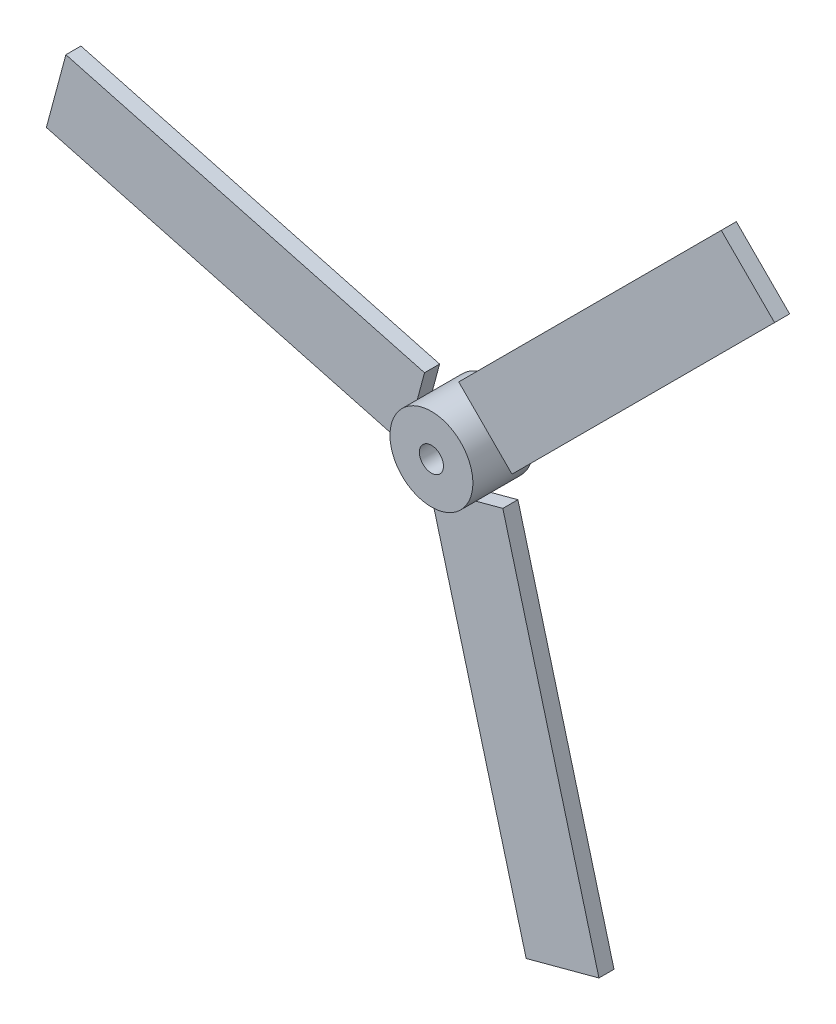
ISO-10303-21;
HEADER;
FILE_DESCRIPTION(('STEP AP214'),'2;1');
FILE_NAME('part.step','',(''),(''),'','','');
FILE_SCHEMA(('AUTOMOTIVE_DESIGN { 1 0 10303 214 1 1 1 1 }'));
ENDSEC;
DATA;
#1=APPLICATION_CONTEXT('core data for automotive mechanical design processes');
#2=APPLICATION_PROTOCOL_DEFINITION('international standard','automotive_design',2000,#1);
#3=PRODUCT_CONTEXT('',#1,'mechanical');
#4=PRODUCT('Part','Part','',(#3));
#5=PRODUCT_RELATED_PRODUCT_CATEGORY('part','',(#4));
#6=PRODUCT_DEFINITION_FORMATION('','',#4);
#7=PRODUCT_DEFINITION_CONTEXT('part definition',#1,'design');
#8=PRODUCT_DEFINITION('design','',#6,#7);
#9=PRODUCT_DEFINITION_SHAPE('','',#8);
#10=(LENGTH_UNIT() NAMED_UNIT(*) SI_UNIT(.MILLI.,.METRE.));
#11=(NAMED_UNIT(*) PLANE_ANGLE_UNIT() SI_UNIT($,.RADIAN.));
#12=(NAMED_UNIT(*) SI_UNIT($,.STERADIAN.) SOLID_ANGLE_UNIT());
#13=UNCERTAINTY_MEASURE_WITH_UNIT(LENGTH_MEASURE(1.E-05),#10,'distance_accuracy_value','');
#14=(GEOMETRIC_REPRESENTATION_CONTEXT(3) GLOBAL_UNCERTAINTY_ASSIGNED_CONTEXT((#13)) GLOBAL_UNIT_ASSIGNED_CONTEXT((#10,
#11,#12)) REPRESENTATION_CONTEXT('',''));
#15=CARTESIAN_POINT('',(0.,0.,0.));
#16=DIRECTION('',(0.,0.,1.));
#17=DIRECTION('',(1.,0.,0.));
#18=AXIS2_PLACEMENT_3D('',#15,#16,#17);
#19=CARTESIAN_POINT('',(42.638538905549,-42.63853890554,14.3));
#20=DIRECTION('',(0.,0.,1.));
#21=DIRECTION('',(1.,0.,0.));
#22=AXIS2_PLACEMENT_3D('',#19,#20,#21);
#23=PLANE('',#22);
#24=CARTESIAN_POINT('',(42.638538905549,-42.63853890554,14.3));
#25=DIRECTION('',(0.,0.,1.));
#26=DIRECTION('',(0.707106781186548,0.707106781186548,0.));
#27=AXIS2_PLACEMENT_3D('',#24,#25,#26);
#28=CIRCLE('',#27,0.8);
#29=CARTESIAN_POINT('',(43.204224330498,-42.0728534806,14.3));
#30=VERTEX_POINT('',#29);
#31=EDGE_CURVE('P0_E21',#30,#30,#28,.T.);
#32=ORIENTED_EDGE('',*,*,#31,.F.);
#33=EDGE_LOOP('',(#32));
#34=FACE_BOUND('',#33,.T.);
#35=CARTESIAN_POINT('',(42.638538905549,-42.63853890554,14.3));
#36=DIRECTION('',(0.,0.,1.));
#37=DIRECTION('',(0.707106781186548,0.707106781186548,0.));
#38=AXIS2_PLACEMENT_3D('',#35,#36,#37);
#39=CIRCLE('',#38,2.75);
#40=CARTESIAN_POINT('',(44.583082553812,-40.69399525728,14.3));
#41=VERTEX_POINT('',#40);
#42=EDGE_CURVE('P0_E58',#41,#41,#39,.T.);
#43=ORIENTED_EDGE('',*,*,#42,.T.);
#44=EDGE_LOOP('',(#43));
#45=FACE_BOUND('',#44,.T.);
#46=ADVANCED_FACE('P0_F17',(#34,#45),#23,.T.);
#47=CARTESIAN_POINT('',(42.638538905549,-42.63853890554,10.3));
#48=DIRECTION('',(0.,0.,1.));
#49=DIRECTION('',(1.,0.,0.));
#50=AXIS2_PLACEMENT_3D('',#47,#48,#49);
#51=PLANE('',#50);
#52=CARTESIAN_POINT('',(42.638538905549,-42.63853890554,10.3));
#53=DIRECTION('',(0.,0.,1.));
#54=DIRECTION('',(0.707106781186548,0.707106781186548,0.));
#55=AXIS2_PLACEMENT_3D('',#52,#53,#54);
#56=CIRCLE('',#55,0.8);
#57=CARTESIAN_POINT('',(43.204224330498,-42.0728534806,10.3));
#58=VERTEX_POINT('',#57);
#59=EDGE_CURVE('P0_E11',#58,#58,#56,.T.);
#60=ORIENTED_EDGE('',*,*,#59,.T.);
#61=EDGE_LOOP('',(#60));
#62=FACE_BOUND('',#61,.T.);
#63=CARTESIAN_POINT('',(42.638538905549,-42.63853890554,10.3));
#64=DIRECTION('',(0.,0.,1.));
#65=DIRECTION('',(0.707106781186548,0.707106781186548,0.));
#66=AXIS2_PLACEMENT_3D('',#63,#64,#65);
#67=CIRCLE('',#66,2.75);
#68=CARTESIAN_POINT('',(44.583082553812,-40.69399525728,10.3));
#69=VERTEX_POINT('',#68);
#70=EDGE_CURVE('P0_E56',#69,#69,#67,.T.);
#71=ORIENTED_EDGE('',*,*,#70,.F.);
#72=EDGE_LOOP('',(#71));
#73=FACE_BOUND('',#72,.T.);
#74=ADVANCED_FACE('P0_F19',(#62,#73),#51,.F.);
#75=CARTESIAN_POINT('',(42.638538905549,-42.63853890554,10.3));
#76=DIRECTION('',(0.,0.,-1.));
#77=DIRECTION('',(0.707106781186548,0.707106781186548,0.));
#78=AXIS2_PLACEMENT_3D('',#75,#76,#77);
#79=CYLINDRICAL_SURFACE('',#78,0.8);
#80=DIRECTION('',(0.,0.,1.));
#81=VECTOR('',#80,1.);
#82=CARTESIAN_POINT('',(43.204224330498,-42.0728534806,10.3));
#83=LINE('',#82,#81);
#84=EDGE_CURVE('P0_E70',#58,#30,#83,.T.);
#85=ORIENTED_EDGE('',*,*,#84,.T.);
#86=ORIENTED_EDGE('',*,*,#31,.T.);
#87=ORIENTED_EDGE('',*,*,#84,.F.);
#88=ORIENTED_EDGE('',*,*,#59,.F.);
#89=EDGE_LOOP('',(#85,#86,#87,#88));
#90=FACE_BOUND('',#89,.T.);
#91=ADVANCED_FACE('P0_F82',(#90),#79,.F.);
#92=CARTESIAN_POINT('',(42.638538905549,-42.63853890554,10.3));
#93=DIRECTION('',(0.,0.,-1.));
#94=DIRECTION('',(0.707106781186548,0.707106781186548,0.));
#95=AXIS2_PLACEMENT_3D('',#92,#93,#94);
#96=CYLINDRICAL_SURFACE('',#95,2.75);
#97=ORIENTED_EDGE('',*,*,#70,.T.);
#98=DIRECTION('',(0.,0.,1.));
#99=VECTOR('',#98,1.);
#100=CARTESIAN_POINT('',(44.583082553812,-40.69399525728,10.3));
#101=LINE('',#100,#99);
#102=EDGE_CURVE('P0_E57',#69,#41,#101,.T.);
#103=ORIENTED_EDGE('',*,*,#102,.T.);
#104=ORIENTED_EDGE('',*,*,#42,.F.);
#105=ORIENTED_EDGE('',*,*,#102,.F.);
#106=EDGE_LOOP('',(#97,#103,#104,#105));
#107=FACE_BOUND('',#106,.T.);
#108=ADVANCED_FACE('P0_F60',(#107),#96,.T.);
#109=CLOSED_SHELL('',(#46,#74,#91,#108));
#110=MANIFOLD_SOLID_BREP('P0_B1',#109);
#111=CARTESIAN_POINT('',(53.329993437089,-31.947084374,12.7));
#112=DIRECTION('',(0.,0.,1.));
#113=DIRECTION('',(1.,0.,0.));
#114=AXIS2_PLACEMENT_3D('',#111,#112,#113);
#115=PLANE('',#114);
#116=DIRECTION('',(0.707106781186548,0.707106781186548,0.));
#117=VECTOR('',#116,1.);
#118=CARTESIAN_POINT('',(46.386204845838,-42.42640687119,12.7));
#119=LINE('',#118,#117);
#120=CARTESIAN_POINT('',(46.386204845838,-42.42640687119,12.7));
#121=VERTEX_POINT('',#120);
#122=CARTESIAN_POINT('',(63.809315934274,-25.00329578275,12.7));
#123=VERTEX_POINT('',#122);
#124=EDGE_CURVE('P1_E83',#121,#123,#119,.T.);
#125=ORIENTED_EDGE('',*,*,#124,.T.);
#126=DIRECTION('',(-0.707106781186548,0.707106781186548,0.));
#127=VECTOR('',#126,1.);
#128=CARTESIAN_POINT('',(63.809315934274,-25.00329578275,12.7));
#129=LINE('',#128,#127);
#130=CARTESIAN_POINT('',(60.273782028341,-21.46776187682,12.7));
#131=VERTEX_POINT('',#130);
#132=EDGE_CURVE('P1_E110',#123,#131,#129,.T.);
#133=ORIENTED_EDGE('',*,*,#132,.T.);
#134=DIRECTION('',(-0.707106781186548,-0.707106781186548,0.));
#135=VECTOR('',#134,1.);
#136=CARTESIAN_POINT('',(60.273782028341,-21.46776187682,12.7));
#137=LINE('',#136,#135);
#138=CARTESIAN_POINT('',(42.850670939905,-38.89087296526,12.7));
#139=VERTEX_POINT('',#138);
#140=EDGE_CURVE('P1_E74',#131,#139,#137,.T.);
#141=ORIENTED_EDGE('',*,*,#140,.T.);
#142=DIRECTION('',(0.707106781186548,-0.707106781186548,0.));
#143=VECTOR('',#142,1.);
#144=CARTESIAN_POINT('',(42.850670939905,-38.89087296526,12.7));
#145=LINE('',#144,#143);
#146=EDGE_CURVE('P1_E11',#139,#121,#145,.T.);
#147=ORIENTED_EDGE('',*,*,#146,.T.);
#148=EDGE_LOOP('',(#125,#133,#141,#147));
#149=FACE_BOUND('',#148,.T.);
#150=ADVANCED_FACE('P1_F17',(#149),#115,.T.);
#151=CARTESIAN_POINT('',(53.329993437089,-31.947084374,11.7));
#152=DIRECTION('',(0.,0.,1.));
#153=DIRECTION('',(1.,0.,0.));
#154=AXIS2_PLACEMENT_3D('',#151,#152,#153);
#155=PLANE('',#154);
#156=DIRECTION('',(0.707106781186548,-0.707106781186548,0.));
#157=VECTOR('',#156,1.);
#158=CARTESIAN_POINT('',(42.850670939905,-38.89087296526,11.7));
#159=LINE('',#158,#157);
#160=CARTESIAN_POINT('',(42.850670939905,-38.89087296526,11.7));
#161=VERTEX_POINT('',#160);
#162=CARTESIAN_POINT('',(46.386204845838,-42.42640687119,11.7));
#163=VERTEX_POINT('',#162);
#164=EDGE_CURVE('P1_E27',#161,#163,#159,.T.);
#165=ORIENTED_EDGE('',*,*,#164,.F.);
#166=DIRECTION('',(-0.707106781186548,-0.707106781186548,0.));
#167=VECTOR('',#166,1.);
#168=CARTESIAN_POINT('',(60.273782028341,-21.46776187682,11.7));
#169=LINE('',#168,#167);
#170=CARTESIAN_POINT('',(60.273782028341,-21.46776187682,11.7));
#171=VERTEX_POINT('',#170);
#172=EDGE_CURVE('P1_E103',#171,#161,#169,.T.);
#173=ORIENTED_EDGE('',*,*,#172,.F.);
#174=DIRECTION('',(-0.707106781186548,0.707106781186548,0.));
#175=VECTOR('',#174,1.);
#176=CARTESIAN_POINT('',(63.809315934274,-25.00329578275,11.7));
#177=LINE('',#176,#175);
#178=CARTESIAN_POINT('',(63.809315934274,-25.00329578275,11.7));
#179=VERTEX_POINT('',#178);
#180=EDGE_CURVE('P1_E84',#179,#171,#177,.T.);
#181=ORIENTED_EDGE('',*,*,#180,.F.);
#182=DIRECTION('',(0.707106781186548,0.707106781186548,0.));
#183=VECTOR('',#182,1.);
#184=CARTESIAN_POINT('',(46.386204845838,-42.42640687119,11.7));
#185=LINE('',#184,#183);
#186=EDGE_CURVE('P1_E81',#163,#179,#185,.T.);
#187=ORIENTED_EDGE('',*,*,#186,.F.);
#188=EDGE_LOOP('',(#165,#173,#181,#187));
#189=FACE_BOUND('',#188,.T.);
#190=ADVANCED_FACE('P1_F19',(#189),#155,.F.);
#191=CARTESIAN_POINT('',(42.850670939905,-38.89087296526,11.7));
#192=DIRECTION('',(0.707106781186548,0.707106781186548,0.));
#193=DIRECTION('',(0.,0.,-1.));
#194=AXIS2_PLACEMENT_3D('',#191,#192,#193);
#195=PLANE('',#194);
#196=ORIENTED_EDGE('',*,*,#164,.T.);
#197=DIRECTION('',(0.,0.,1.));
#198=VECTOR('',#197,1.);
#199=CARTESIAN_POINT('',(46.386204845838,-42.42640687119,11.7));
#200=LINE('',#199,#198);
#201=EDGE_CURVE('P1_E67',#163,#121,#200,.T.);
#202=ORIENTED_EDGE('',*,*,#201,.T.);
#203=ORIENTED_EDGE('',*,*,#146,.F.);
#204=DIRECTION('',(0.,0.,1.));
#205=VECTOR('',#204,1.);
#206=CARTESIAN_POINT('',(42.850670939905,-38.89087296526,11.7));
#207=LINE('',#206,#205);
#208=EDGE_CURVE('P1_E71',#161,#139,#207,.T.);
#209=ORIENTED_EDGE('',*,*,#208,.F.);
#210=EDGE_LOOP('',(#196,#202,#203,#209));
#211=FACE_BOUND('',#210,.T.);
#212=ADVANCED_FACE('P1_F68',(#211),#195,.F.);
#213=CARTESIAN_POINT('',(60.273782028341,-21.46776187682,11.7));
#214=DIRECTION('',(0.707106781186548,-0.707106781186548,0.));
#215=DIRECTION('',(0.,0.,-1.));
#216=AXIS2_PLACEMENT_3D('',#213,#214,#215);
#217=PLANE('',#216);
#218=ORIENTED_EDGE('',*,*,#172,.T.);
#219=ORIENTED_EDGE('',*,*,#208,.T.);
#220=ORIENTED_EDGE('',*,*,#140,.F.);
#221=DIRECTION('',(0.,0.,1.));
#222=VECTOR('',#221,1.);
#223=CARTESIAN_POINT('',(60.273782028341,-21.46776187682,11.7));
#224=LINE('',#223,#222);
#225=EDGE_CURVE('P1_E99',#171,#131,#224,.T.);
#226=ORIENTED_EDGE('',*,*,#225,.F.);
#227=EDGE_LOOP('',(#218,#219,#220,#226));
#228=FACE_BOUND('',#227,.T.);
#229=ADVANCED_FACE('P1_F117',(#228),#217,.F.);
#230=CARTESIAN_POINT('',(63.809315934274,-25.00329578275,11.7));
#231=DIRECTION('',(-0.707106781186548,-0.707106781186548,0.));
#232=DIRECTION('',(-0.707106781186548,0.707106781186548,0.));
#233=AXIS2_PLACEMENT_3D('',#230,#231,#232);
#234=PLANE('',#233);
#235=ORIENTED_EDGE('',*,*,#180,.T.);
#236=ORIENTED_EDGE('',*,*,#225,.T.);
#237=ORIENTED_EDGE('',*,*,#132,.F.);
#238=DIRECTION('',(0.,0.,1.));
#239=VECTOR('',#238,1.);
#240=CARTESIAN_POINT('',(63.809315934274,-25.00329578275,11.7));
#241=LINE('',#240,#239);
#242=EDGE_CURVE('P1_E89',#179,#123,#241,.T.);
#243=ORIENTED_EDGE('',*,*,#242,.F.);
#244=EDGE_LOOP('',(#235,#236,#237,#243));
#245=FACE_BOUND('',#244,.T.);
#246=ADVANCED_FACE('P1_F118',(#245),#234,.F.);
#247=CARTESIAN_POINT('',(46.386204845838,-42.42640687119,11.7));
#248=DIRECTION('',(-0.707106781186548,0.707106781186548,0.));
#249=DIRECTION('',(0.,0.,1.));
#250=AXIS2_PLACEMENT_3D('',#247,#248,#249);
#251=PLANE('',#250);
#252=ORIENTED_EDGE('',*,*,#186,.T.);
#253=ORIENTED_EDGE('',*,*,#242,.T.);
#254=ORIENTED_EDGE('',*,*,#124,.F.);
#255=ORIENTED_EDGE('',*,*,#201,.F.);
#256=EDGE_LOOP('',(#252,#253,#254,#255));
#257=FACE_BOUND('',#256,.T.);
#258=ADVANCED_FACE('P1_F78',(#257),#251,.F.);
#259=CLOSED_SHELL('',(#150,#190,#212,#229,#246,#258));
#260=MANIFOLD_SOLID_BREP('P1_B1',#259);
#261=CARTESIAN_POINT('',(28.033740412058,-38.72519494359,12.7));
#262=DIRECTION('',(0.,0.,1.));
#263=DIRECTION('',(1.,0.,0.));
#264=AXIS2_PLACEMENT_3D('',#261,#262,#263);
#265=PLANE('',#264);
#266=DIRECTION('',(-0.965925826288944,0.258819045102985,0.));
#267=VECTOR('',#266,1.);
#268=CARTESIAN_POINT('',(40.580994204696,-39.49903101353,12.7));
#269=LINE('',#268,#267);
#270=CARTESIAN_POINT('',(40.580994204696,-39.49903101353,12.7));
#271=VERTEX_POINT('',#270);
#272=CARTESIAN_POINT('',(16.780581844933,-33.12172974221,12.7));
#273=VERTEX_POINT('',#272);
#274=EDGE_CURVE('P2_E83',#271,#273,#269,.T.);
#275=ORIENTED_EDGE('',*,*,#274,.T.);
#276=DIRECTION('',(-0.258819045102985,-0.965925826288944,0.));
#277=VECTOR('',#276,1.);
#278=CARTESIAN_POINT('',(16.780581844933,-33.12172974221,12.7));
#279=LINE('',#278,#277);
#280=CARTESIAN_POINT('',(15.48648661942,-37.95135887365,12.7));
#281=VERTEX_POINT('',#280);
#282=EDGE_CURVE('P2_E101',#273,#281,#279,.T.);
#283=ORIENTED_EDGE('',*,*,#282,.T.);
#284=DIRECTION('',(0.965925826288944,-0.258819045102985,0.));
#285=VECTOR('',#284,1.);
#286=CARTESIAN_POINT('',(15.48648661942,-37.95135887365,12.7));
#287=LINE('',#286,#285);
#288=CARTESIAN_POINT('',(39.286898979183,-44.32866014498,12.7));
#289=VERTEX_POINT('',#288);
#290=EDGE_CURVE('P2_E76',#281,#289,#287,.T.);
#291=ORIENTED_EDGE('',*,*,#290,.T.);
#292=DIRECTION('',(0.258819045102985,0.965925826288944,0.));
#293=VECTOR('',#292,1.);
#294=CARTESIAN_POINT('',(39.286898979183,-44.32866014498,12.7));
#295=LINE('',#294,#293);
#296=EDGE_CURVE('P2_E11',#289,#271,#295,.T.);
#297=ORIENTED_EDGE('',*,*,#296,.T.);
#298=EDGE_LOOP('',(#275,#283,#291,#297));
#299=FACE_BOUND('',#298,.T.);
#300=ADVANCED_FACE('P2_F17',(#299),#265,.T.);
#301=CARTESIAN_POINT('',(28.033740412058,-38.72519494359,11.7));
#302=DIRECTION('',(0.,0.,1.));
#303=DIRECTION('',(1.,0.,0.));
#304=AXIS2_PLACEMENT_3D('',#301,#302,#303);
#305=PLANE('',#304);
#306=DIRECTION('',(0.258819045102985,0.965925826288944,0.));
#307=VECTOR('',#306,1.);
#308=CARTESIAN_POINT('',(39.286898979183,-44.32866014498,11.7));
#309=LINE('',#308,#307);
#310=CARTESIAN_POINT('',(39.286898979183,-44.32866014498,11.7));
#311=VERTEX_POINT('',#310);
#312=CARTESIAN_POINT('',(40.580994204696,-39.49903101353,11.7));
#313=VERTEX_POINT('',#312);
#314=EDGE_CURVE('P2_E21',#311,#313,#309,.T.);
#315=ORIENTED_EDGE('',*,*,#314,.F.);
#316=DIRECTION('',(0.965925826288944,-0.258819045102985,0.));
#317=VECTOR('',#316,1.);
#318=CARTESIAN_POINT('',(15.48648661942,-37.95135887365,11.7));
#319=LINE('',#318,#317);
#320=CARTESIAN_POINT('',(15.48648661942,-37.95135887365,11.7));
#321=VERTEX_POINT('',#320);
#322=EDGE_CURVE('P2_E99',#321,#311,#319,.T.);
#323=ORIENTED_EDGE('',*,*,#322,.F.);
#324=DIRECTION('',(-0.258819045102985,-0.965925826288944,0.));
#325=VECTOR('',#324,1.);
#326=CARTESIAN_POINT('',(16.780581844933,-33.12172974221,11.7));
#327=LINE('',#326,#325);
#328=CARTESIAN_POINT('',(16.780581844933,-33.12172974221,11.7));
#329=VERTEX_POINT('',#328);
#330=EDGE_CURVE('P2_E84',#329,#321,#327,.T.);
#331=ORIENTED_EDGE('',*,*,#330,.F.);
#332=DIRECTION('',(-0.965925826288944,0.258819045102985,0.));
#333=VECTOR('',#332,1.);
#334=CARTESIAN_POINT('',(40.580994204696,-39.49903101353,11.7));
#335=LINE('',#334,#333);
#336=EDGE_CURVE('P2_E81',#313,#329,#335,.T.);
#337=ORIENTED_EDGE('',*,*,#336,.F.);
#338=EDGE_LOOP('',(#315,#323,#331,#337));
#339=FACE_BOUND('',#338,.T.);
#340=ADVANCED_FACE('P2_F19',(#339),#305,.F.);
#341=CARTESIAN_POINT('',(39.286898979183,-44.32866014498,11.7));
#342=DIRECTION('',(-0.965925826288944,0.258819045102985,0.));
#343=DIRECTION('',(0.,0.,1.));
#344=AXIS2_PLACEMENT_3D('',#341,#342,#343);
#345=PLANE('',#344);
#346=ORIENTED_EDGE('',*,*,#314,.T.);
#347=DIRECTION('',(0.,0.,1.));
#348=VECTOR('',#347,1.);
#349=CARTESIAN_POINT('',(40.580994204696,-39.49903101353,11.7));
#350=LINE('',#349,#348);
#351=EDGE_CURVE('P2_E69',#313,#271,#350,.T.);
#352=ORIENTED_EDGE('',*,*,#351,.T.);
#353=ORIENTED_EDGE('',*,*,#296,.F.);
#354=DIRECTION('',(0.,0.,1.));
#355=VECTOR('',#354,1.);
#356=CARTESIAN_POINT('',(39.286898979183,-44.32866014498,11.7));
#357=LINE('',#356,#355);
#358=EDGE_CURVE('P2_E73',#311,#289,#357,.T.);
#359=ORIENTED_EDGE('',*,*,#358,.F.);
#360=EDGE_LOOP('',(#346,#352,#353,#359));
#361=FACE_BOUND('',#360,.T.);
#362=ADVANCED_FACE('P2_F67',(#361),#345,.F.);
#363=CARTESIAN_POINT('',(15.48648661942,-37.95135887365,11.7));
#364=DIRECTION('',(0.258819045102985,0.965925826288944,0.));
#365=DIRECTION('',(0.,0.,-1.));
#366=AXIS2_PLACEMENT_3D('',#363,#364,#365);
#367=PLANE('',#366);
#368=ORIENTED_EDGE('',*,*,#322,.T.);
#369=ORIENTED_EDGE('',*,*,#358,.T.);
#370=ORIENTED_EDGE('',*,*,#290,.F.);
#371=DIRECTION('',(0.,0.,1.));
#372=VECTOR('',#371,1.);
#373=CARTESIAN_POINT('',(15.48648661942,-37.95135887365,11.7));
#374=LINE('',#373,#372);
#375=EDGE_CURVE('P2_E97',#321,#281,#374,.T.);
#376=ORIENTED_EDGE('',*,*,#375,.F.);
#377=EDGE_LOOP('',(#368,#369,#370,#376));
#378=FACE_BOUND('',#377,.T.);
#379=ADVANCED_FACE('P2_F117',(#378),#367,.F.);
#380=CARTESIAN_POINT('',(16.780581844933,-33.12172974221,11.7));
#381=DIRECTION('',(0.965925826288944,-0.258819045102985,0.));
#382=DIRECTION('',(0.,0.,-1.));
#383=AXIS2_PLACEMENT_3D('',#380,#381,#382);
#384=PLANE('',#383);
#385=ORIENTED_EDGE('',*,*,#330,.T.);
#386=ORIENTED_EDGE('',*,*,#375,.T.);
#387=ORIENTED_EDGE('',*,*,#282,.F.);
#388=DIRECTION('',(0.,0.,1.));
#389=VECTOR('',#388,1.);
#390=CARTESIAN_POINT('',(16.780581844933,-33.12172974221,11.7));
#391=LINE('',#390,#389);
#392=EDGE_CURVE('P2_E89',#329,#273,#391,.T.);
#393=ORIENTED_EDGE('',*,*,#392,.F.);
#394=EDGE_LOOP('',(#385,#386,#387,#393));
#395=FACE_BOUND('',#394,.T.);
#396=ADVANCED_FACE('P2_F118',(#395),#384,.F.);
#397=CARTESIAN_POINT('',(40.580994204696,-39.49903101353,11.7));
#398=DIRECTION('',(-0.258819045102985,-0.965925826288944,0.));
#399=DIRECTION('',(-0.965925826288944,0.258819045102985,0.));
#400=AXIS2_PLACEMENT_3D('',#397,#398,#399);
#401=PLANE('',#400);
#402=ORIENTED_EDGE('',*,*,#336,.T.);
#403=ORIENTED_EDGE('',*,*,#392,.T.);
#404=ORIENTED_EDGE('',*,*,#274,.F.);
#405=ORIENTED_EDGE('',*,*,#351,.F.);
#406=EDGE_LOOP('',(#402,#403,#404,#405));
#407=FACE_BOUND('',#406,.T.);
#408=ADVANCED_FACE('P2_F78',(#407),#401,.F.);
#409=CLOSED_SHELL('',(#300,#340,#362,#379,#396,#408));
#410=MANIFOLD_SOLID_BREP('P2_B1',#409);
#411=CARTESIAN_POINT('',(46.551882867499,-57.24333739904,12.7));
#412=DIRECTION('',(0.,0.,1.));
#413=DIRECTION('',(1.,0.,0.));
#414=AXIS2_PLACEMENT_3D('',#411,#412,#413);
#415=PLANE('',#414);
#416=DIRECTION('',(0.258819045102985,-0.965925826288944,0.));
#417=VECTOR('',#416,1.);
#418=CARTESIAN_POINT('',(40.948417666113,-45.99017883191,12.7));
#419=LINE('',#418,#417);
#420=CARTESIAN_POINT('',(40.948417666113,-45.99017883191,12.7));
#421=VERTEX_POINT('',#420);
#422=CARTESIAN_POINT('',(47.325718937439,-69.79059119167,12.7));
#423=VERTEX_POINT('',#422);
#424=EDGE_CURVE('P3_E94',#421,#423,#419,.T.);
#425=ORIENTED_EDGE('',*,*,#424,.T.);
#426=DIRECTION('',(0.965925826288944,0.258819045102985,0.));
#427=VECTOR('',#426,1.);
#428=CARTESIAN_POINT('',(47.325718937439,-69.79059119167,12.7));
#429=LINE('',#428,#427);
#430=CARTESIAN_POINT('',(52.155348068885,-68.49649596616,12.7));
#431=VERTEX_POINT('',#430);
#432=EDGE_CURVE('P3_E89',#423,#431,#429,.T.);
#433=ORIENTED_EDGE('',*,*,#432,.T.);
#434=DIRECTION('',(-0.258819045102985,0.965925826288944,0.));
#435=VECTOR('',#434,1.);
#436=CARTESIAN_POINT('',(52.155348068885,-68.49649596616,12.7));
#437=LINE('',#436,#435);
#438=CARTESIAN_POINT('',(45.778046797559,-44.6960836064,12.7));
#439=VERTEX_POINT('',#438);
#440=EDGE_CURVE('P3_E108',#431,#439,#437,.T.);
#441=ORIENTED_EDGE('',*,*,#440,.T.);
#442=DIRECTION('',(-0.965925826288944,-0.258819045102985,0.));
#443=VECTOR('',#442,1.);
#444=CARTESIAN_POINT('',(45.778046797559,-44.6960836064,12.7));
#445=LINE('',#444,#443);
#446=EDGE_CURVE('P3_E10',#439,#421,#445,.T.);
#447=ORIENTED_EDGE('',*,*,#446,.T.);
#448=EDGE_LOOP('',(#425,#433,#441,#447));
#449=FACE_BOUND('',#448,.T.);
#450=ADVANCED_FACE('P3_F16',(#449),#415,.T.);
#451=CARTESIAN_POINT('',(46.551882867499,-57.24333739904,11.7));
#452=DIRECTION('',(0.,0.,1.));
#453=DIRECTION('',(1.,0.,0.));
#454=AXIS2_PLACEMENT_3D('',#451,#452,#453);
#455=PLANE('',#454);
#456=DIRECTION('',(-0.965925826288944,-0.258819045102985,0.));
#457=VECTOR('',#456,1.);
#458=CARTESIAN_POINT('',(45.778046797559,-44.6960836064,11.7));
#459=LINE('',#458,#457);
#460=CARTESIAN_POINT('',(45.778046797559,-44.6960836064,11.7));
#461=VERTEX_POINT('',#460);
#462=CARTESIAN_POINT('',(40.948417666113,-45.99017883191,11.7));
#463=VERTEX_POINT('',#462);
#464=EDGE_CURVE('P3_E20',#461,#463,#459,.T.);
#465=ORIENTED_EDGE('',*,*,#464,.F.);
#466=DIRECTION('',(-0.258819045102985,0.965925826288944,0.));
#467=VECTOR('',#466,1.);
#468=CARTESIAN_POINT('',(52.155348068885,-68.49649596616,11.7));
#469=LINE('',#468,#467);
#470=CARTESIAN_POINT('',(52.155348068885,-68.49649596616,11.7));
#471=VERTEX_POINT('',#470);
#472=EDGE_CURVE('P3_E62',#471,#461,#469,.T.);
#473=ORIENTED_EDGE('',*,*,#472,.F.);
#474=DIRECTION('',(0.965925826288944,0.258819045102985,0.));
#475=VECTOR('',#474,1.);
#476=CARTESIAN_POINT('',(47.325718937439,-69.79059119167,11.7));
#477=LINE('',#476,#475);
#478=CARTESIAN_POINT('',(47.325718937439,-69.79059119167,11.7));
#479=VERTEX_POINT('',#478);
#480=EDGE_CURVE('P3_E76',#479,#471,#477,.T.);
#481=ORIENTED_EDGE('',*,*,#480,.F.);
#482=DIRECTION('',(0.258819045102985,-0.965925826288944,0.));
#483=VECTOR('',#482,1.);
#484=CARTESIAN_POINT('',(40.948417666113,-45.99017883191,11.7));
#485=LINE('',#484,#483);
#486=EDGE_CURVE('P3_E78',#463,#479,#485,.T.);
#487=ORIENTED_EDGE('',*,*,#486,.F.);
#488=EDGE_LOOP('',(#465,#473,#481,#487));
#489=FACE_BOUND('',#488,.T.);
#490=ADVANCED_FACE('P3_F18',(#489),#455,.F.);
#491=CARTESIAN_POINT('',(45.778046797559,-44.6960836064,11.7));
#492=DIRECTION('',(0.258819045102985,-0.965925826288944,0.));
#493=DIRECTION('',(0.,0.,-1.));
#494=AXIS2_PLACEMENT_3D('',#491,#492,#493);
#495=PLANE('',#494);
#496=ORIENTED_EDGE('',*,*,#464,.T.);
#497=DIRECTION('',(0.,0.,1.));
#498=VECTOR('',#497,1.);
#499=CARTESIAN_POINT('',(40.948417666113,-45.99017883191,11.7));
#500=LINE('',#499,#498);
#501=EDGE_CURVE('P3_E82',#463,#421,#500,.T.);
#502=ORIENTED_EDGE('',*,*,#501,.T.);
#503=ORIENTED_EDGE('',*,*,#446,.F.);
#504=DIRECTION('',(0.,0.,1.));
#505=VECTOR('',#504,1.);
#506=CARTESIAN_POINT('',(45.778046797559,-44.6960836064,11.7));
#507=LINE('',#506,#505);
#508=EDGE_CURVE('P3_E104',#461,#439,#507,.T.);
#509=ORIENTED_EDGE('',*,*,#508,.F.);
#510=EDGE_LOOP('',(#496,#502,#503,#509));
#511=FACE_BOUND('',#510,.T.);
#512=ADVANCED_FACE('P3_F146',(#511),#495,.F.);
#513=CARTESIAN_POINT('',(52.155348068885,-68.49649596616,11.7));
#514=DIRECTION('',(-0.965925826288944,-0.258819045102985,0.));
#515=DIRECTION('',(-0.258819045102985,0.965925826288944,0.));
#516=AXIS2_PLACEMENT_3D('',#513,#514,#515);
#517=PLANE('',#516);
#518=ORIENTED_EDGE('',*,*,#472,.T.);
#519=ORIENTED_EDGE('',*,*,#508,.T.);
#520=ORIENTED_EDGE('',*,*,#440,.F.);
#521=DIRECTION('',(0.,0.,1.));
#522=VECTOR('',#521,1.);
#523=CARTESIAN_POINT('',(52.155348068885,-68.49649596616,11.7));
#524=LINE('',#523,#522);
#525=EDGE_CURVE('P3_E83',#471,#431,#524,.T.);
#526=ORIENTED_EDGE('',*,*,#525,.F.);
#527=EDGE_LOOP('',(#518,#519,#520,#526));
#528=FACE_BOUND('',#527,.T.);
#529=ADVANCED_FACE('P3_F143',(#528),#517,.F.);
#530=CARTESIAN_POINT('',(47.325718937439,-69.79059119167,11.7));
#531=DIRECTION('',(-0.258819045102985,0.965925826288944,0.));
#532=DIRECTION('',(0.,0.,1.));
#533=AXIS2_PLACEMENT_3D('',#530,#531,#532);
#534=PLANE('',#533);
#535=ORIENTED_EDGE('',*,*,#480,.T.);
#536=ORIENTED_EDGE('',*,*,#525,.T.);
#537=ORIENTED_EDGE('',*,*,#432,.F.);
#538=DIRECTION('',(0.,0.,1.));
#539=VECTOR('',#538,1.);
#540=CARTESIAN_POINT('',(47.325718937439,-69.79059119167,11.7));
#541=LINE('',#540,#539);
#542=EDGE_CURVE('P3_E87',#479,#423,#541,.T.);
#543=ORIENTED_EDGE('',*,*,#542,.F.);
#544=EDGE_LOOP('',(#535,#536,#537,#543));
#545=FACE_BOUND('',#544,.T.);
#546=ADVANCED_FACE('P3_F86',(#545),#534,.F.);
#547=CARTESIAN_POINT('',(40.948417666113,-45.99017883191,11.7));
#548=DIRECTION('',(0.965925826288944,0.258819045102985,0.));
#549=DIRECTION('',(0.,0.,-1.));
#550=AXIS2_PLACEMENT_3D('',#547,#548,#549);
#551=PLANE('',#550);
#552=ORIENTED_EDGE('',*,*,#486,.T.);
#553=ORIENTED_EDGE('',*,*,#542,.T.);
#554=ORIENTED_EDGE('',*,*,#424,.F.);
#555=ORIENTED_EDGE('',*,*,#501,.F.);
#556=EDGE_LOOP('',(#552,#553,#554,#555));
#557=FACE_BOUND('',#556,.T.);
#558=ADVANCED_FACE('P3_F96',(#557),#551,.F.);
#559=CLOSED_SHELL('',(#450,#490,#512,#529,#546,#558));
#560=MANIFOLD_SOLID_BREP('P3_B1',#559);
#561=ADVANCED_BREP_SHAPE_REPRESENTATION('',(#18,#110,#260,#410,#560),#14);
#562=SHAPE_DEFINITION_REPRESENTATION(#9,#561);
ENDSEC;
END-ISO-10303-21;
